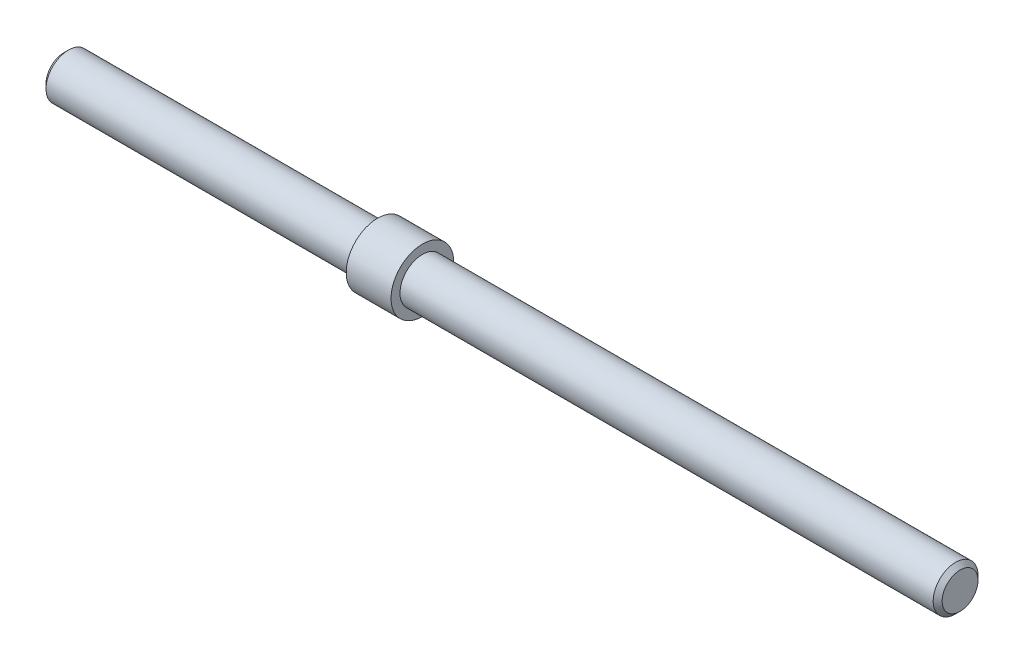
ISO-10303-21;
HEADER;
FILE_DESCRIPTION(('STEP AP214'),'2;1');
FILE_NAME('part.step','',(''),(''),'','','');
FILE_SCHEMA(('AUTOMOTIVE_DESIGN { 1 0 10303 214 1 1 1 1 }'));
ENDSEC;
DATA;
#1=APPLICATION_CONTEXT('core data for automotive mechanical design processes');
#2=APPLICATION_PROTOCOL_DEFINITION('international standard','automotive_design',2000,#1);
#3=PRODUCT_CONTEXT('',#1,'mechanical');
#4=PRODUCT('Part','Part','',(#3));
#5=PRODUCT_RELATED_PRODUCT_CATEGORY('part','',(#4));
#6=PRODUCT_DEFINITION_FORMATION('','',#4);
#7=PRODUCT_DEFINITION_CONTEXT('part definition',#1,'design');
#8=PRODUCT_DEFINITION('design','',#6,#7);
#9=PRODUCT_DEFINITION_SHAPE('','',#8);
#10=(LENGTH_UNIT() NAMED_UNIT(*) SI_UNIT(.MILLI.,.METRE.));
#11=(NAMED_UNIT(*) PLANE_ANGLE_UNIT() SI_UNIT($,.RADIAN.));
#12=(NAMED_UNIT(*) SI_UNIT($,.STERADIAN.) SOLID_ANGLE_UNIT());
#13=UNCERTAINTY_MEASURE_WITH_UNIT(LENGTH_MEASURE(1.E-05),#10,'distance_accuracy_value','');
#14=(GEOMETRIC_REPRESENTATION_CONTEXT(3) GLOBAL_UNCERTAINTY_ASSIGNED_CONTEXT((#13)) GLOBAL_UNIT_ASSIGNED_CONTEXT((#10,
#11,#12)) REPRESENTATION_CONTEXT('',''));
#15=CARTESIAN_POINT('',(0.,0.,0.));
#16=DIRECTION('',(0.,0.,1.));
#17=DIRECTION('',(1.,0.,0.));
#18=AXIS2_PLACEMENT_3D('',#15,#16,#17);
#19=CARTESIAN_POINT('',(800.,0.,0.));
#20=DIRECTION('',(-1.,0.,0.));
#21=DIRECTION('',(0.,0.,1.));
#22=AXIS2_PLACEMENT_3D('',#19,#20,#21);
#23=CYLINDRICAL_SURFACE('',#22,20.);
#24=CARTESIAN_POINT('',(320.,0.,0.));
#25=DIRECTION('',(1.,0.,0.));
#26=DIRECTION('',(0.,0.,-1.));
#27=AXIS2_PLACEMENT_3D('',#24,#25,#26);
#28=CIRCLE('',#27,20.);
#29=CARTESIAN_POINT('',(320.,0.,-20.));
#30=VERTEX_POINT('',#29);
#31=EDGE_CURVE('E41',#30,#30,#28,.T.);
#32=ORIENTED_EDGE('',*,*,#31,.T.);
#33=EDGE_LOOP('',(#32));
#34=FACE_BOUND('',#33,.T.);
#35=CARTESIAN_POINT('',(796.,0.,0.));
#36=DIRECTION('',(1.,0.,0.));
#37=DIRECTION('',(0.,0.,-1.));
#38=AXIS2_PLACEMENT_3D('',#35,#36,#37);
#39=CIRCLE('',#38,20.);
#40=CARTESIAN_POINT('',(796.,0.,-20.));
#41=VERTEX_POINT('',#40);
#42=EDGE_CURVE('E57',#41,#41,#39,.F.);
#43=ORIENTED_EDGE('',*,*,#42,.T.);
#44=EDGE_LOOP('',(#43));
#45=FACE_BOUND('',#44,.T.);
#46=ADVANCED_FACE('F36',(#34,#45),#23,.T.);
#47=CARTESIAN_POINT('',(800.,0.,0.));
#48=DIRECTION('',(1.,0.,0.));
#49=DIRECTION('',(0.,0.,-1.));
#50=AXIS2_PLACEMENT_3D('',#47,#48,#49);
#51=PLANE('',#50);
#52=CARTESIAN_POINT('',(800.,0.,0.));
#53=DIRECTION('',(1.,0.,0.));
#54=DIRECTION('',(0.,0.,-1.));
#55=AXIS2_PLACEMENT_3D('',#52,#53,#54);
#56=CIRCLE('',#55,16.);
#57=CARTESIAN_POINT('',(800.,0.,-16.));
#58=VERTEX_POINT('',#57);
#59=EDGE_CURVE('E45',#58,#58,#56,.T.);
#60=ORIENTED_EDGE('',*,*,#59,.T.);
#61=EDGE_LOOP('',(#60));
#62=FACE_BOUND('',#61,.T.);
#63=ADVANCED_FACE('F86',(#62),#51,.T.);
#64=CARTESIAN_POINT('',(800.,0.,0.));
#65=DIRECTION('',(-1.,0.,0.));
#66=DIRECTION('',(0.,0.,1.));
#67=AXIS2_PLACEMENT_3D('',#64,#65,#66);
#68=CONICAL_SURFACE('',#67,16.,0.78539816339746);
#69=ORIENTED_EDGE('',*,*,#42,.F.);
#70=EDGE_LOOP('',(#69));
#71=FACE_BOUND('',#70,.T.);
#72=ORIENTED_EDGE('',*,*,#59,.F.);
#73=EDGE_LOOP('',(#72));
#74=FACE_BOUND('',#73,.T.);
#75=ADVANCED_FACE('F39',(#71,#74),#68,.T.);
#76=CARTESIAN_POINT('',(320.,0.,0.));
#77=DIRECTION('',(-1.,0.,0.));
#78=DIRECTION('',(0.,0.,1.));
#79=AXIS2_PLACEMENT_3D('',#76,#77,#78);
#80=CYLINDRICAL_SURFACE('',#79,28.);
#81=CARTESIAN_POINT('',(320.,0.,0.));
#82=DIRECTION('',(1.,0.,0.));
#83=DIRECTION('',(0.,0.,-1.));
#84=AXIS2_PLACEMENT_3D('',#81,#82,#83);
#85=CIRCLE('',#84,28.);
#86=CARTESIAN_POINT('',(320.,0.,-28.));
#87=VERTEX_POINT('',#86);
#88=EDGE_CURVE('E63',#87,#87,#85,.T.);
#89=ORIENTED_EDGE('',*,*,#88,.F.);
#90=EDGE_LOOP('',(#89));
#91=FACE_BOUND('',#90,.T.);
#92=CARTESIAN_POINT('',(280.,0.,0.));
#93=DIRECTION('',(1.,0.,0.));
#94=DIRECTION('',(0.,0.,-1.));
#95=AXIS2_PLACEMENT_3D('',#92,#93,#94);
#96=CIRCLE('',#95,28.);
#97=CARTESIAN_POINT('',(280.,0.,-28.));
#98=VERTEX_POINT('',#97);
#99=EDGE_CURVE('E60',#98,#98,#96,.T.);
#100=ORIENTED_EDGE('',*,*,#99,.T.);
#101=EDGE_LOOP('',(#100));
#102=FACE_BOUND('',#101,.T.);
#103=ADVANCED_FACE('F75',(#91,#102),#80,.T.);
#104=CARTESIAN_POINT('',(320.,0.,0.));
#105=DIRECTION('',(1.,0.,0.));
#106=DIRECTION('',(0.,0.,-1.));
#107=AXIS2_PLACEMENT_3D('',#104,#105,#106);
#108=PLANE('',#107);
#109=ORIENTED_EDGE('',*,*,#31,.F.);
#110=EDGE_LOOP('',(#109));
#111=FACE_BOUND('',#110,.T.);
#112=ORIENTED_EDGE('',*,*,#88,.T.);
#113=EDGE_LOOP('',(#112));
#114=FACE_BOUND('',#113,.T.);
#115=ADVANCED_FACE('F72',(#111,#114),#108,.T.);
#116=CARTESIAN_POINT('',(280.,0.,0.));
#117=DIRECTION('',(1.,0.,0.));
#118=DIRECTION('',(0.,0.,-1.));
#119=AXIS2_PLACEMENT_3D('',#116,#117,#118);
#120=PLANE('',#119);
#121=CARTESIAN_POINT('',(280.,0.,0.));
#122=DIRECTION('',(1.,0.,0.));
#123=DIRECTION('',(0.,0.,-1.));
#124=AXIS2_PLACEMENT_3D('',#121,#122,#123);
#125=CIRCLE('',#124,20.);
#126=CARTESIAN_POINT('',(280.,0.,-20.));
#127=VERTEX_POINT('',#126);
#128=EDGE_CURVE('E10',#127,#127,#125,.T.);
#129=ORIENTED_EDGE('',*,*,#128,.T.);
#130=EDGE_LOOP('',(#129));
#131=FACE_BOUND('',#130,.T.);
#132=ORIENTED_EDGE('',*,*,#99,.F.);
#133=EDGE_LOOP('',(#132));
#134=FACE_BOUND('',#133,.T.);
#135=ADVANCED_FACE('F74',(#131,#134),#120,.F.);
#136=CARTESIAN_POINT('',(0.,0.,0.));
#137=DIRECTION('',(1.,0.,0.));
#138=DIRECTION('',(0.,0.,-1.));
#139=AXIS2_PLACEMENT_3D('',#136,#137,#138);
#140=PLANE('',#139);
#141=CARTESIAN_POINT('',(0.,0.,0.));
#142=DIRECTION('',(1.,0.,0.));
#143=DIRECTION('',(0.,0.,-1.));
#144=AXIS2_PLACEMENT_3D('',#141,#142,#143);
#145=CIRCLE('',#144,16.0000000000001);
#146=CARTESIAN_POINT('',(0.,0.,-16.0000000000001));
#147=VERTEX_POINT('',#146);
#148=EDGE_CURVE('E49',#147,#147,#145,.F.);
#149=ORIENTED_EDGE('',*,*,#148,.T.);
#150=EDGE_LOOP('',(#149));
#151=FACE_BOUND('',#150,.T.);
#152=ADVANCED_FACE('F81',(#151),#140,.F.);
#153=CARTESIAN_POINT('',(3.99999999999978,0.,0.));
#154=DIRECTION('',(1.,0.,0.));
#155=DIRECTION('',(0.,0.,-1.));
#156=AXIS2_PLACEMENT_3D('',#153,#154,#155);
#157=CONICAL_SURFACE('',#156,20.,0.78539816339746);
#158=ORIENTED_EDGE('',*,*,#148,.F.);
#159=EDGE_LOOP('',(#158));
#160=FACE_BOUND('',#159,.T.);
#161=CARTESIAN_POINT('',(3.99999999999978,0.,0.));
#162=DIRECTION('',(1.,0.,0.));
#163=DIRECTION('',(0.,0.,-1.));
#164=AXIS2_PLACEMENT_3D('',#161,#162,#163);
#165=CIRCLE('',#164,20.);
#166=CARTESIAN_POINT('',(3.99999999999978,0.,-20.));
#167=VERTEX_POINT('',#166);
#168=EDGE_CURVE('E54',#167,#167,#165,.T.);
#169=ORIENTED_EDGE('',*,*,#168,.F.);
#170=EDGE_LOOP('',(#169));
#171=FACE_BOUND('',#170,.T.);
#172=ADVANCED_FACE('F96',(#160,#171),#157,.T.);
#173=ORIENTED_EDGE('',*,*,#168,.T.);
#174=EDGE_LOOP('',(#173));
#175=FACE_BOUND('',#174,.T.);
#176=ORIENTED_EDGE('',*,*,#128,.F.);
#177=EDGE_LOOP('',(#176));
#178=FACE_BOUND('',#177,.T.);
#179=ADVANCED_FACE('F88',(#175,#178),#23,.T.);
#180=CLOSED_SHELL('',(#46,#63,#75,#103,#115,#135,#152,#172,#179));
#181=MANIFOLD_SOLID_BREP('B2',#180);
#182=ADVANCED_BREP_SHAPE_REPRESENTATION('',(#18,#181),#14);
#183=SHAPE_DEFINITION_REPRESENTATION(#9,#182);
ENDSEC;
END-ISO-10303-21;
